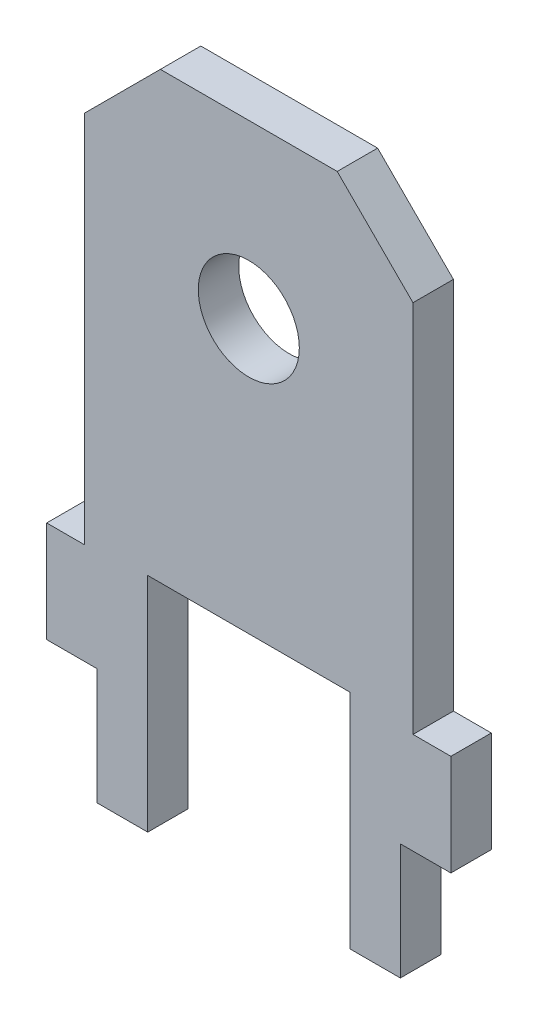
ISO-10303-21;
HEADER;
FILE_DESCRIPTION(('STEP AP214'),'2;1');
FILE_NAME('part.step','',(''),(''),'','','');
FILE_SCHEMA(('AUTOMOTIVE_DESIGN { 1 0 10303 214 1 1 1 1 }'));
ENDSEC;
DATA;
#1=APPLICATION_CONTEXT('core data for automotive mechanical design processes');
#2=APPLICATION_PROTOCOL_DEFINITION('international standard','automotive_design',2000,#1);
#3=PRODUCT_CONTEXT('',#1,'mechanical');
#4=PRODUCT('Part','Part','',(#3));
#5=PRODUCT_RELATED_PRODUCT_CATEGORY('part','',(#4));
#6=PRODUCT_DEFINITION_FORMATION('','',#4);
#7=PRODUCT_DEFINITION_CONTEXT('part definition',#1,'design');
#8=PRODUCT_DEFINITION('design','',#6,#7);
#9=PRODUCT_DEFINITION_SHAPE('','',#8);
#10=(LENGTH_UNIT() NAMED_UNIT(*) SI_UNIT(.MILLI.,.METRE.));
#11=(NAMED_UNIT(*) PLANE_ANGLE_UNIT() SI_UNIT($,.RADIAN.));
#12=(NAMED_UNIT(*) SI_UNIT($,.STERADIAN.) SOLID_ANGLE_UNIT());
#13=UNCERTAINTY_MEASURE_WITH_UNIT(LENGTH_MEASURE(1.E-05),#10,'distance_accuracy_value','');
#14=(GEOMETRIC_REPRESENTATION_CONTEXT(3) GLOBAL_UNCERTAINTY_ASSIGNED_CONTEXT((#13)) GLOBAL_UNIT_ASSIGNED_CONTEXT((#10,
#11,#12)) REPRESENTATION_CONTEXT('',''));
#15=CARTESIAN_POINT('',(0.,0.,0.));
#16=DIRECTION('',(0.,0.,1.));
#17=DIRECTION('',(1.,0.,0.));
#18=AXIS2_PLACEMENT_3D('',#15,#16,#17);
#19=CARTESIAN_POINT('',(-2.99999999999999,25.7495027624309,0.8));
#20=DIRECTION('',(0.,0.,-1.));
#21=DIRECTION('',(-1.,0.,0.));
#22=AXIS2_PLACEMENT_3D('',#19,#20,#21);
#23=PLANE('',#22);
#24=DIRECTION('',(0.,-1.,0.));
#25=VECTOR('',#24,1.);
#26=CARTESIAN_POINT('',(-3.,12.5495027624309,0.8));
#27=LINE('',#26,#25);
#28=CARTESIAN_POINT('',(-3.,14.8495027624309,0.8));
#29=VERTEX_POINT('',#28);
#30=CARTESIAN_POINT('',(-3.,12.5495027624309,0.8));
#31=VERTEX_POINT('',#30);
#32=EDGE_CURVE('E229',#29,#31,#27,.T.);
#33=ORIENTED_EDGE('',*,*,#32,.T.);
#34=DIRECTION('',(1.,0.,0.));
#35=VECTOR('',#34,1.);
#36=CARTESIAN_POINT('',(-3.,12.5495027624309,0.8));
#37=LINE('',#36,#35);
#38=CARTESIAN_POINT('',(-2.,12.5495027624309,0.8));
#39=VERTEX_POINT('',#38);
#40=EDGE_CURVE('E127',#31,#39,#37,.T.);
#41=ORIENTED_EDGE('',*,*,#40,.T.);
#42=DIRECTION('',(0.,1.,0.));
#43=VECTOR('',#42,1.);
#44=CARTESIAN_POINT('',(-2.,12.5495027624309,0.8));
#45=LINE('',#44,#43);
#46=CARTESIAN_POINT('',(-2.,16.9495027624309,0.8));
#47=VERTEX_POINT('',#46);
#48=EDGE_CURVE('E274',#39,#47,#45,.T.);
#49=ORIENTED_EDGE('',*,*,#48,.T.);
#50=DIRECTION('',(1.,0.,0.));
#51=VECTOR('',#50,1.);
#52=CARTESIAN_POINT('',(-2.,16.9495027624309,0.8));
#53=LINE('',#52,#51);
#54=CARTESIAN_POINT('',(2.,16.9495027624309,0.8));
#55=VERTEX_POINT('',#54);
#56=EDGE_CURVE('E293',#47,#55,#53,.T.);
#57=ORIENTED_EDGE('',*,*,#56,.T.);
#58=DIRECTION('',(0.,-1.,0.));
#59=VECTOR('',#58,1.);
#60=CARTESIAN_POINT('',(2.,12.5495027624309,0.8));
#61=LINE('',#60,#59);
#62=CARTESIAN_POINT('',(2.,12.5495027624309,0.8));
#63=VERTEX_POINT('',#62);
#64=EDGE_CURVE('E290',#55,#63,#61,.T.);
#65=ORIENTED_EDGE('',*,*,#64,.T.);
#66=DIRECTION('',(1.,0.,0.));
#67=VECTOR('',#66,1.);
#68=CARTESIAN_POINT('',(2.,12.5495027624309,0.8));
#69=LINE('',#68,#67);
#70=CARTESIAN_POINT('',(3.,12.5495027624309,0.8));
#71=VERTEX_POINT('',#70);
#72=EDGE_CURVE('E292',#63,#71,#69,.T.);
#73=ORIENTED_EDGE('',*,*,#72,.T.);
#74=DIRECTION('',(0.,1.,0.));
#75=VECTOR('',#74,1.);
#76=CARTESIAN_POINT('',(3.,12.5495027624309,0.8));
#77=LINE('',#76,#75);
#78=CARTESIAN_POINT('',(3.,14.8495027624309,0.8));
#79=VERTEX_POINT('',#78);
#80=EDGE_CURVE('E295',#71,#79,#77,.T.);
#81=ORIENTED_EDGE('',*,*,#80,.T.);
#82=DIRECTION('',(1.,0.,0.));
#83=VECTOR('',#82,1.);
#84=CARTESIAN_POINT('',(3.,14.8495027624309,0.8));
#85=LINE('',#84,#83);
#86=CARTESIAN_POINT('',(4.,14.8495027624309,0.8));
#87=VERTEX_POINT('',#86);
#88=EDGE_CURVE('E301',#79,#87,#85,.T.);
#89=ORIENTED_EDGE('',*,*,#88,.T.);
#90=DIRECTION('',(0.,1.,0.));
#91=VECTOR('',#90,1.);
#92=CARTESIAN_POINT('',(4.,14.8495027624309,0.8));
#93=LINE('',#92,#91);
#94=CARTESIAN_POINT('',(4.,16.8495027624309,0.8));
#95=VERTEX_POINT('',#94);
#96=EDGE_CURVE('E303',#87,#95,#93,.T.);
#97=ORIENTED_EDGE('',*,*,#96,.T.);
#98=DIRECTION('',(-1.,0.,0.));
#99=VECTOR('',#98,1.);
#100=CARTESIAN_POINT('',(3.25000000000001,16.8495027624309,0.8));
#101=LINE('',#100,#99);
#102=CARTESIAN_POINT('',(3.25000000000001,16.8495027624309,0.8));
#103=VERTEX_POINT('',#102);
#104=EDGE_CURVE('E305',#95,#103,#101,.T.);
#105=ORIENTED_EDGE('',*,*,#104,.T.);
#106=DIRECTION('',(0.,1.,0.));
#107=VECTOR('',#106,1.);
#108=CARTESIAN_POINT('',(3.25000000000001,16.8495027624309,0.8));
#109=LINE('',#108,#107);
#110=CARTESIAN_POINT('',(3.25,24.2495027624309,0.8));
#111=VERTEX_POINT('',#110);
#112=EDGE_CURVE('E307',#103,#111,#109,.T.);
#113=ORIENTED_EDGE('',*,*,#112,.T.);
#114=DIRECTION('',(-0.707106781186548,0.707106781186547,0.));
#115=VECTOR('',#114,1.);
#116=CARTESIAN_POINT('',(1.75,25.7495027624309,0.8));
#117=LINE('',#116,#115);
#118=CARTESIAN_POINT('',(1.75,25.7495027624309,0.8));
#119=VERTEX_POINT('',#118);
#120=EDGE_CURVE('E309',#111,#119,#117,.T.);
#121=ORIENTED_EDGE('',*,*,#120,.T.);
#122=DIRECTION('',(-1.,0.,0.));
#123=VECTOR('',#122,1.);
#124=CARTESIAN_POINT('',(-1.75,25.7495027624309,0.8));
#125=LINE('',#124,#123);
#126=CARTESIAN_POINT('',(-1.75,25.7495027624309,0.8));
#127=VERTEX_POINT('',#126);
#128=EDGE_CURVE('E311',#119,#127,#125,.T.);
#129=ORIENTED_EDGE('',*,*,#128,.T.);
#130=DIRECTION('',(-0.707106781186548,-0.707106781186547,0.));
#131=VECTOR('',#130,1.);
#132=CARTESIAN_POINT('',(-3.25,24.2495027624309,0.8));
#133=LINE('',#132,#131);
#134=CARTESIAN_POINT('',(-3.25,24.2495027624309,0.8));
#135=VERTEX_POINT('',#134);
#136=EDGE_CURVE('E313',#127,#135,#133,.T.);
#137=ORIENTED_EDGE('',*,*,#136,.T.);
#138=DIRECTION('',(0.,-1.,0.));
#139=VECTOR('',#138,1.);
#140=CARTESIAN_POINT('',(-3.25000000000001,16.8495027624309,0.8));
#141=LINE('',#140,#139);
#142=CARTESIAN_POINT('',(-3.25000000000001,16.8495027624309,0.8));
#143=VERTEX_POINT('',#142);
#144=EDGE_CURVE('E176',#135,#143,#141,.T.);
#145=ORIENTED_EDGE('',*,*,#144,.T.);
#146=DIRECTION('',(-1.,0.,0.));
#147=VECTOR('',#146,1.);
#148=CARTESIAN_POINT('',(-3.25000000000001,16.8495027624309,0.8));
#149=LINE('',#148,#147);
#150=CARTESIAN_POINT('',(-4.,16.8495027624309,0.8));
#151=VERTEX_POINT('',#150);
#152=EDGE_CURVE('E170',#143,#151,#149,.T.);
#153=ORIENTED_EDGE('',*,*,#152,.T.);
#154=DIRECTION('',(0.,-1.,0.));
#155=VECTOR('',#154,1.);
#156=CARTESIAN_POINT('',(-4.,14.8495027624309,0.8));
#157=LINE('',#156,#155);
#158=CARTESIAN_POINT('',(-4.,14.8495027624309,0.8));
#159=VERTEX_POINT('',#158);
#160=EDGE_CURVE('E174',#151,#159,#157,.T.);
#161=ORIENTED_EDGE('',*,*,#160,.T.);
#162=DIRECTION('',(1.,0.,0.));
#163=VECTOR('',#162,1.);
#164=CARTESIAN_POINT('',(-3.,14.8495027624309,0.8));
#165=LINE('',#164,#163);
#166=EDGE_CURVE('E54',#159,#29,#165,.T.);
#167=ORIENTED_EDGE('',*,*,#166,.T.);
#168=EDGE_LOOP('',(#33,#41,#49,#57,#65,#73,#81,#89,#97,#105,#113,#121,#129,#137,#145,#153,#161,#167));
#169=FACE_BOUND('',#168,.T.);
#170=CARTESIAN_POINT('',(0.,22.3495027624309,0.8));
#171=DIRECTION('',(0.,0.,1.));
#172=DIRECTION('',(1.,0.,0.));
#173=AXIS2_PLACEMENT_3D('',#170,#171,#172);
#174=CIRCLE('',#173,1.);
#175=CARTESIAN_POINT('',(1.,22.3495027624309,0.8));
#176=VERTEX_POINT('',#175);
#177=EDGE_CURVE('E198',#176,#176,#174,.T.);
#178=ORIENTED_EDGE('',*,*,#177,.F.);
#179=EDGE_LOOP('',(#178));
#180=FACE_BOUND('',#179,.T.);
#181=ADVANCED_FACE('F37',(#169,#180),#23,.F.);
#182=CARTESIAN_POINT('',(-2.99999999999999,25.7495027624309,0.));
#183=DIRECTION('',(0.,0.,-1.));
#184=DIRECTION('',(-1.,0.,0.));
#185=AXIS2_PLACEMENT_3D('',#182,#183,#184);
#186=PLANE('',#185);
#187=DIRECTION('',(0.,-1.,0.));
#188=VECTOR('',#187,1.);
#189=CARTESIAN_POINT('',(-3.,12.5495027624309,0.));
#190=LINE('',#189,#188);
#191=CARTESIAN_POINT('',(-3.,14.8495027624309,0.));
#192=VERTEX_POINT('',#191);
#193=CARTESIAN_POINT('',(-3.,12.5495027624309,0.));
#194=VERTEX_POINT('',#193);
#195=EDGE_CURVE('E194',#192,#194,#190,.T.);
#196=ORIENTED_EDGE('',*,*,#195,.F.);
#197=DIRECTION('',(1.,0.,0.));
#198=VECTOR('',#197,1.);
#199=CARTESIAN_POINT('',(-3.,14.8495027624309,0.));
#200=LINE('',#199,#198);
#201=CARTESIAN_POINT('',(-4.,14.8495027624309,0.));
#202=VERTEX_POINT('',#201);
#203=EDGE_CURVE('E119',#202,#192,#200,.T.);
#204=ORIENTED_EDGE('',*,*,#203,.F.);
#205=DIRECTION('',(0.,-1.,0.));
#206=VECTOR('',#205,1.);
#207=CARTESIAN_POINT('',(-4.,14.8495027624309,0.));
#208=LINE('',#207,#206);
#209=CARTESIAN_POINT('',(-4.,16.8495027624309,0.));
#210=VERTEX_POINT('',#209);
#211=EDGE_CURVE('E113',#210,#202,#208,.T.);
#212=ORIENTED_EDGE('',*,*,#211,.F.);
#213=DIRECTION('',(-1.,0.,0.));
#214=VECTOR('',#213,1.);
#215=CARTESIAN_POINT('',(-3.25000000000001,16.8495027624309,0.));
#216=LINE('',#215,#214);
#217=CARTESIAN_POINT('',(-3.25000000000001,16.8495027624309,0.));
#218=VERTEX_POINT('',#217);
#219=EDGE_CURVE('E184',#218,#210,#216,.T.);
#220=ORIENTED_EDGE('',*,*,#219,.F.);
#221=DIRECTION('',(0.,-1.,0.));
#222=VECTOR('',#221,1.);
#223=CARTESIAN_POINT('',(-3.25000000000001,16.8495027624309,0.));
#224=LINE('',#223,#222);
#225=CARTESIAN_POINT('',(-3.25,24.2495027624309,0.));
#226=VERTEX_POINT('',#225);
#227=EDGE_CURVE('E224',#226,#218,#224,.T.);
#228=ORIENTED_EDGE('',*,*,#227,.F.);
#229=DIRECTION('',(-0.707106781186548,-0.707106781186547,0.));
#230=VECTOR('',#229,1.);
#231=CARTESIAN_POINT('',(-3.25,24.2495027624309,0.));
#232=LINE('',#231,#230);
#233=CARTESIAN_POINT('',(-1.75,25.7495027624309,0.));
#234=VERTEX_POINT('',#233);
#235=EDGE_CURVE('E222',#234,#226,#232,.T.);
#236=ORIENTED_EDGE('',*,*,#235,.F.);
#237=DIRECTION('',(-1.,0.,0.));
#238=VECTOR('',#237,1.);
#239=CARTESIAN_POINT('',(-1.75,25.7495027624309,0.));
#240=LINE('',#239,#238);
#241=CARTESIAN_POINT('',(1.75,25.7495027624309,0.));
#242=VERTEX_POINT('',#241);
#243=EDGE_CURVE('E220',#242,#234,#240,.T.);
#244=ORIENTED_EDGE('',*,*,#243,.F.);
#245=DIRECTION('',(-0.707106781186548,0.707106781186547,0.));
#246=VECTOR('',#245,1.);
#247=CARTESIAN_POINT('',(1.75,25.7495027624309,0.));
#248=LINE('',#247,#246);
#249=CARTESIAN_POINT('',(3.25,24.2495027624309,0.));
#250=VERTEX_POINT('',#249);
#251=EDGE_CURVE('E218',#250,#242,#248,.T.);
#252=ORIENTED_EDGE('',*,*,#251,.F.);
#253=DIRECTION('',(0.,1.,0.));
#254=VECTOR('',#253,1.);
#255=CARTESIAN_POINT('',(3.25000000000001,16.8495027624309,0.));
#256=LINE('',#255,#254);
#257=CARTESIAN_POINT('',(3.25000000000001,16.8495027624309,0.));
#258=VERTEX_POINT('',#257);
#259=EDGE_CURVE('E216',#258,#250,#256,.T.);
#260=ORIENTED_EDGE('',*,*,#259,.F.);
#261=DIRECTION('',(-1.,0.,0.));
#262=VECTOR('',#261,1.);
#263=CARTESIAN_POINT('',(3.25000000000001,16.8495027624309,0.));
#264=LINE('',#263,#262);
#265=CARTESIAN_POINT('',(4.,16.8495027624309,0.));
#266=VERTEX_POINT('',#265);
#267=EDGE_CURVE('E214',#266,#258,#264,.T.);
#268=ORIENTED_EDGE('',*,*,#267,.F.);
#269=DIRECTION('',(0.,1.,0.));
#270=VECTOR('',#269,1.);
#271=CARTESIAN_POINT('',(4.,14.8495027624309,0.));
#272=LINE('',#271,#270);
#273=CARTESIAN_POINT('',(4.,14.8495027624309,0.));
#274=VERTEX_POINT('',#273);
#275=EDGE_CURVE('E212',#274,#266,#272,.T.);
#276=ORIENTED_EDGE('',*,*,#275,.F.);
#277=DIRECTION('',(1.,0.,0.));
#278=VECTOR('',#277,1.);
#279=CARTESIAN_POINT('',(3.,14.8495027624309,0.));
#280=LINE('',#279,#278);
#281=CARTESIAN_POINT('',(3.,14.8495027624309,0.));
#282=VERTEX_POINT('',#281);
#283=EDGE_CURVE('E210',#282,#274,#280,.T.);
#284=ORIENTED_EDGE('',*,*,#283,.F.);
#285=DIRECTION('',(0.,1.,0.));
#286=VECTOR('',#285,1.);
#287=CARTESIAN_POINT('',(3.,12.5495027624309,0.));
#288=LINE('',#287,#286);
#289=CARTESIAN_POINT('',(3.,12.5495027624309,0.));
#290=VERTEX_POINT('',#289);
#291=EDGE_CURVE('E208',#290,#282,#288,.T.);
#292=ORIENTED_EDGE('',*,*,#291,.F.);
#293=DIRECTION('',(1.,0.,0.));
#294=VECTOR('',#293,1.);
#295=CARTESIAN_POINT('',(2.,12.5495027624309,0.));
#296=LINE('',#295,#294);
#297=CARTESIAN_POINT('',(2.,12.5495027624309,0.));
#298=VERTEX_POINT('',#297);
#299=EDGE_CURVE('E206',#298,#290,#296,.T.);
#300=ORIENTED_EDGE('',*,*,#299,.F.);
#301=DIRECTION('',(0.,-1.,0.));
#302=VECTOR('',#301,1.);
#303=CARTESIAN_POINT('',(2.,12.5495027624309,0.));
#304=LINE('',#303,#302);
#305=CARTESIAN_POINT('',(2.,16.9495027624309,0.));
#306=VERTEX_POINT('',#305);
#307=EDGE_CURVE('E204',#306,#298,#304,.T.);
#308=ORIENTED_EDGE('',*,*,#307,.F.);
#309=DIRECTION('',(1.,0.,0.));
#310=VECTOR('',#309,1.);
#311=CARTESIAN_POINT('',(-2.,16.9495027624309,0.));
#312=LINE('',#311,#310);
#313=CARTESIAN_POINT('',(-2.,16.9495027624309,0.));
#314=VERTEX_POINT('',#313);
#315=EDGE_CURVE('E202',#314,#306,#312,.T.);
#316=ORIENTED_EDGE('',*,*,#315,.F.);
#317=DIRECTION('',(0.,1.,0.));
#318=VECTOR('',#317,1.);
#319=CARTESIAN_POINT('',(-2.,12.5495027624309,0.));
#320=LINE('',#319,#318);
#321=CARTESIAN_POINT('',(-2.,12.5495027624309,0.));
#322=VERTEX_POINT('',#321);
#323=EDGE_CURVE('E200',#322,#314,#320,.T.);
#324=ORIENTED_EDGE('',*,*,#323,.F.);
#325=DIRECTION('',(1.,0.,0.));
#326=VECTOR('',#325,1.);
#327=CARTESIAN_POINT('',(-3.,12.5495027624309,0.));
#328=LINE('',#327,#326);
#329=EDGE_CURVE('E197',#194,#322,#328,.T.);
#330=ORIENTED_EDGE('',*,*,#329,.F.);
#331=EDGE_LOOP('',(#196,#204,#212,#220,#228,#236,#244,#252,#260,#268,#276,#284,#292,#300,#308,
#316,#324,#330));
#332=FACE_BOUND('',#331,.T.);
#333=CARTESIAN_POINT('',(0.,22.3495027624309,0.));
#334=DIRECTION('',(0.,0.,1.));
#335=DIRECTION('',(1.,0.,0.));
#336=AXIS2_PLACEMENT_3D('',#333,#334,#335);
#337=CIRCLE('',#336,1.);
#338=CARTESIAN_POINT('',(1.,22.3495027624309,0.));
#339=VERTEX_POINT('',#338);
#340=EDGE_CURVE('E375',#339,#339,#337,.T.);
#341=ORIENTED_EDGE('',*,*,#340,.T.);
#342=EDGE_LOOP('',(#341));
#343=FACE_BOUND('',#342,.T.);
#344=ADVANCED_FACE('F278',(#332,#343),#186,.T.);
#345=CARTESIAN_POINT('',(-3.,12.5495027624309,0.8));
#346=DIRECTION('',(1.,0.,0.));
#347=DIRECTION('',(0.,1.,0.));
#348=AXIS2_PLACEMENT_3D('',#345,#346,#347);
#349=PLANE('',#348);
#350=ORIENTED_EDGE('',*,*,#195,.T.);
#351=DIRECTION('',(0.,0.,-1.));
#352=VECTOR('',#351,1.);
#353=CARTESIAN_POINT('',(-3.,12.5495027624309,0.8));
#354=LINE('',#353,#352);
#355=EDGE_CURVE('E11',#31,#194,#354,.T.);
#356=ORIENTED_EDGE('',*,*,#355,.F.);
#357=ORIENTED_EDGE('',*,*,#32,.F.);
#358=DIRECTION('',(0.,0.,-1.));
#359=VECTOR('',#358,1.);
#360=CARTESIAN_POINT('',(-3.,14.8495027624309,0.8));
#361=LINE('',#360,#359);
#362=EDGE_CURVE('E190',#29,#192,#361,.T.);
#363=ORIENTED_EDGE('',*,*,#362,.T.);
#364=EDGE_LOOP('',(#350,#356,#357,#363));
#365=FACE_BOUND('',#364,.T.);
#366=ADVANCED_FACE('F39',(#365),#349,.F.);
#367=CARTESIAN_POINT('',(-3.,12.5495027624309,0.8));
#368=DIRECTION('',(0.,1.,0.));
#369=DIRECTION('',(0.,0.,1.));
#370=AXIS2_PLACEMENT_3D('',#367,#368,#369);
#371=PLANE('',#370);
#372=CARTESIAN_POINT('',(-2.5,12.5495027624309,0.4));
#373=DIRECTION('',(0.,-1.,0.));
#374=DIRECTION('',(0.,0.,1.));
#375=AXIS2_PLACEMENT_3D('',#372,#373,#374);
#376=CIRCLE('',#375,0.25);
#377=CARTESIAN_POINT('',(-2.5,12.5495027624309,0.65));
#378=VERTEX_POINT('',#377);
#379=EDGE_CURVE('E366',#378,#378,#376,.T.);
#380=ORIENTED_EDGE('',*,*,#379,.F.);
#381=EDGE_LOOP('',(#380));
#382=FACE_BOUND('',#381,.T.);
#383=ORIENTED_EDGE('',*,*,#329,.T.);
#384=DIRECTION('',(0.,0.,-1.));
#385=VECTOR('',#384,1.);
#386=CARTESIAN_POINT('',(-2.,12.5495027624309,0.8));
#387=LINE('',#386,#385);
#388=EDGE_CURVE('E46',#39,#322,#387,.T.);
#389=ORIENTED_EDGE('',*,*,#388,.F.);
#390=ORIENTED_EDGE('',*,*,#40,.F.);
#391=ORIENTED_EDGE('',*,*,#355,.T.);
#392=EDGE_LOOP('',(#383,#389,#390,#391));
#393=FACE_BOUND('',#392,.T.);
#394=ADVANCED_FACE('F452',(#382,#393),#371,.F.);
#395=CARTESIAN_POINT('',(-2.,12.5495027624309,0.8));
#396=DIRECTION('',(-1.,0.,0.));
#397=DIRECTION('',(0.,-1.,0.));
#398=AXIS2_PLACEMENT_3D('',#395,#396,#397);
#399=PLANE('',#398);
#400=ORIENTED_EDGE('',*,*,#323,.T.);
#401=DIRECTION('',(0.,0.,-1.));
#402=VECTOR('',#401,1.);
#403=CARTESIAN_POINT('',(-2.,16.9495027624309,0.8));
#404=LINE('',#403,#402);
#405=EDGE_CURVE('E266',#47,#314,#404,.T.);
#406=ORIENTED_EDGE('',*,*,#405,.F.);
#407=ORIENTED_EDGE('',*,*,#48,.F.);
#408=ORIENTED_EDGE('',*,*,#388,.T.);
#409=EDGE_LOOP('',(#400,#406,#407,#408));
#410=FACE_BOUND('',#409,.T.);
#411=ADVANCED_FACE('F272',(#410),#399,.F.);
#412=CARTESIAN_POINT('',(-2.,16.9495027624309,0.8));
#413=DIRECTION('',(0.,1.,0.));
#414=DIRECTION('',(0.,0.,1.));
#415=AXIS2_PLACEMENT_3D('',#412,#413,#414);
#416=PLANE('',#415);
#417=ORIENTED_EDGE('',*,*,#315,.T.);
#418=DIRECTION('',(0.,0.,-1.));
#419=VECTOR('',#418,1.);
#420=CARTESIAN_POINT('',(2.,16.9495027624309,0.8));
#421=LINE('',#420,#419);
#422=EDGE_CURVE('E263',#55,#306,#421,.T.);
#423=ORIENTED_EDGE('',*,*,#422,.F.);
#424=ORIENTED_EDGE('',*,*,#56,.F.);
#425=ORIENTED_EDGE('',*,*,#405,.T.);
#426=EDGE_LOOP('',(#417,#423,#424,#425));
#427=FACE_BOUND('',#426,.T.);
#428=ADVANCED_FACE('F284',(#427),#416,.F.);
#429=CARTESIAN_POINT('',(2.,12.5495027624309,0.8));
#430=DIRECTION('',(1.,0.,0.));
#431=DIRECTION('',(0.,0.,-1.));
#432=AXIS2_PLACEMENT_3D('',#429,#430,#431);
#433=PLANE('',#432);
#434=ORIENTED_EDGE('',*,*,#307,.T.);
#435=DIRECTION('',(0.,0.,-1.));
#436=VECTOR('',#435,1.);
#437=CARTESIAN_POINT('',(2.,12.5495027624309,0.8));
#438=LINE('',#437,#436);
#439=EDGE_CURVE('E260',#63,#298,#438,.T.);
#440=ORIENTED_EDGE('',*,*,#439,.F.);
#441=ORIENTED_EDGE('',*,*,#64,.F.);
#442=ORIENTED_EDGE('',*,*,#422,.T.);
#443=EDGE_LOOP('',(#434,#440,#441,#442));
#444=FACE_BOUND('',#443,.T.);
#445=ADVANCED_FACE('F288',(#444),#433,.F.);
#446=CARTESIAN_POINT('',(2.,12.5495027624309,0.8));
#447=DIRECTION('',(0.,1.,0.));
#448=DIRECTION('',(0.,0.,1.));
#449=AXIS2_PLACEMENT_3D('',#446,#447,#448);
#450=PLANE('',#449);
#451=CARTESIAN_POINT('',(2.5,12.5495027624309,0.4));
#452=DIRECTION('',(0.,-1.,0.));
#453=DIRECTION('',(0.,0.,-1.));
#454=AXIS2_PLACEMENT_3D('',#451,#452,#453);
#455=CIRCLE('',#454,0.25);
#456=CARTESIAN_POINT('',(2.5,12.5495027624309,0.15));
#457=VERTEX_POINT('',#456);
#458=EDGE_CURVE('E365',#457,#457,#455,.T.);
#459=ORIENTED_EDGE('',*,*,#458,.F.);
#460=EDGE_LOOP('',(#459));
#461=FACE_BOUND('',#460,.T.);
#462=ORIENTED_EDGE('',*,*,#299,.T.);
#463=DIRECTION('',(0.,0.,-1.));
#464=VECTOR('',#463,1.);
#465=CARTESIAN_POINT('',(3.,12.5495027624309,0.8));
#466=LINE('',#465,#464);
#467=EDGE_CURVE('E257',#71,#290,#466,.T.);
#468=ORIENTED_EDGE('',*,*,#467,.F.);
#469=ORIENTED_EDGE('',*,*,#72,.F.);
#470=ORIENTED_EDGE('',*,*,#439,.T.);
#471=EDGE_LOOP('',(#462,#468,#469,#470));
#472=FACE_BOUND('',#471,.T.);
#473=ADVANCED_FACE('F389',(#461,#472),#450,.F.);
#474=CARTESIAN_POINT('',(3.,12.5495027624309,0.8));
#475=DIRECTION('',(-1.,0.,0.));
#476=DIRECTION('',(0.,-1.,0.));
#477=AXIS2_PLACEMENT_3D('',#474,#475,#476);
#478=PLANE('',#477);
#479=ORIENTED_EDGE('',*,*,#291,.T.);
#480=DIRECTION('',(0.,0.,-1.));
#481=VECTOR('',#480,1.);
#482=CARTESIAN_POINT('',(3.,14.8495027624309,0.8));
#483=LINE('',#482,#481);
#484=EDGE_CURVE('E254',#79,#282,#483,.T.);
#485=ORIENTED_EDGE('',*,*,#484,.F.);
#486=ORIENTED_EDGE('',*,*,#80,.F.);
#487=ORIENTED_EDGE('',*,*,#467,.T.);
#488=EDGE_LOOP('',(#479,#485,#486,#487));
#489=FACE_BOUND('',#488,.T.);
#490=ADVANCED_FACE('F392',(#489),#478,.F.);
#491=CARTESIAN_POINT('',(3.,14.8495027624309,0.8));
#492=DIRECTION('',(0.,1.,0.));
#493=DIRECTION('',(0.,0.,1.));
#494=AXIS2_PLACEMENT_3D('',#491,#492,#493);
#495=PLANE('',#494);
#496=ORIENTED_EDGE('',*,*,#283,.T.);
#497=DIRECTION('',(0.,0.,-1.));
#498=VECTOR('',#497,1.);
#499=CARTESIAN_POINT('',(4.,14.8495027624309,0.8));
#500=LINE('',#499,#498);
#501=EDGE_CURVE('E251',#87,#274,#500,.T.);
#502=ORIENTED_EDGE('',*,*,#501,.F.);
#503=ORIENTED_EDGE('',*,*,#88,.F.);
#504=ORIENTED_EDGE('',*,*,#484,.T.);
#505=EDGE_LOOP('',(#496,#502,#503,#504));
#506=FACE_BOUND('',#505,.T.);
#507=ADVANCED_FACE('F404',(#506),#495,.F.);
#508=CARTESIAN_POINT('',(4.,14.8495027624309,0.8));
#509=DIRECTION('',(-1.,0.,0.));
#510=DIRECTION('',(0.,0.,1.));
#511=AXIS2_PLACEMENT_3D('',#508,#509,#510);
#512=PLANE('',#511);
#513=ORIENTED_EDGE('',*,*,#275,.T.);
#514=DIRECTION('',(0.,0.,-1.));
#515=VECTOR('',#514,1.);
#516=CARTESIAN_POINT('',(4.,16.8495027624309,0.8));
#517=LINE('',#516,#515);
#518=EDGE_CURVE('E248',#95,#266,#517,.T.);
#519=ORIENTED_EDGE('',*,*,#518,.F.);
#520=ORIENTED_EDGE('',*,*,#96,.F.);
#521=ORIENTED_EDGE('',*,*,#501,.T.);
#522=EDGE_LOOP('',(#513,#519,#520,#521));
#523=FACE_BOUND('',#522,.T.);
#524=ADVANCED_FACE('F408',(#523),#512,.F.);
#525=CARTESIAN_POINT('',(3.25000000000001,16.8495027624309,0.8));
#526=DIRECTION('',(0.,-1.,0.));
#527=DIRECTION('',(0.,0.,-1.));
#528=AXIS2_PLACEMENT_3D('',#525,#526,#527);
#529=PLANE('',#528);
#530=ORIENTED_EDGE('',*,*,#267,.T.);
#531=DIRECTION('',(0.,0.,-1.));
#532=VECTOR('',#531,1.);
#533=CARTESIAN_POINT('',(3.25000000000001,16.8495027624309,0.8));
#534=LINE('',#533,#532);
#535=EDGE_CURVE('E245',#103,#258,#534,.T.);
#536=ORIENTED_EDGE('',*,*,#535,.F.);
#537=ORIENTED_EDGE('',*,*,#104,.F.);
#538=ORIENTED_EDGE('',*,*,#518,.T.);
#539=EDGE_LOOP('',(#530,#536,#537,#538));
#540=FACE_BOUND('',#539,.T.);
#541=ADVANCED_FACE('F415',(#540),#529,.F.);
#542=CARTESIAN_POINT('',(3.25000000000001,16.8495027624309,0.8));
#543=DIRECTION('',(-1.,0.,0.));
#544=DIRECTION('',(0.,-1.,0.));
#545=AXIS2_PLACEMENT_3D('',#542,#543,#544);
#546=PLANE('',#545);
#547=ORIENTED_EDGE('',*,*,#259,.T.);
#548=DIRECTION('',(0.,0.,-1.));
#549=VECTOR('',#548,1.);
#550=CARTESIAN_POINT('',(3.25,24.2495027624309,0.8));
#551=LINE('',#550,#549);
#552=EDGE_CURVE('E242',#111,#250,#551,.T.);
#553=ORIENTED_EDGE('',*,*,#552,.F.);
#554=ORIENTED_EDGE('',*,*,#112,.F.);
#555=ORIENTED_EDGE('',*,*,#535,.T.);
#556=EDGE_LOOP('',(#547,#553,#554,#555));
#557=FACE_BOUND('',#556,.T.);
#558=ADVANCED_FACE('F418',(#557),#546,.F.);
#559=CARTESIAN_POINT('',(1.75,25.7495027624309,0.8));
#560=DIRECTION('',(-0.707106781186547,-0.707106781186548,0.));
#561=DIRECTION('',(0.707106781186548,-0.707106781186547,0.));
#562=AXIS2_PLACEMENT_3D('',#559,#560,#561);
#563=PLANE('',#562);
#564=ORIENTED_EDGE('',*,*,#251,.T.);
#565=DIRECTION('',(0.,0.,-1.));
#566=VECTOR('',#565,1.);
#567=CARTESIAN_POINT('',(1.75,25.7495027624309,0.8));
#568=LINE('',#567,#566);
#569=EDGE_CURVE('E239',#119,#242,#568,.T.);
#570=ORIENTED_EDGE('',*,*,#569,.F.);
#571=ORIENTED_EDGE('',*,*,#120,.F.);
#572=ORIENTED_EDGE('',*,*,#552,.T.);
#573=EDGE_LOOP('',(#564,#570,#571,#572));
#574=FACE_BOUND('',#573,.T.);
#575=ADVANCED_FACE('F423',(#574),#563,.F.);
#576=CARTESIAN_POINT('',(-1.75,25.7495027624309,0.8));
#577=DIRECTION('',(0.,-1.,0.));
#578=DIRECTION('',(0.,0.,-1.));
#579=AXIS2_PLACEMENT_3D('',#576,#577,#578);
#580=PLANE('',#579);
#581=ORIENTED_EDGE('',*,*,#243,.T.);
#582=DIRECTION('',(0.,0.,-1.));
#583=VECTOR('',#582,1.);
#584=CARTESIAN_POINT('',(-1.75,25.7495027624309,0.8));
#585=LINE('',#584,#583);
#586=EDGE_CURVE('E236',#127,#234,#585,.T.);
#587=ORIENTED_EDGE('',*,*,#586,.F.);
#588=ORIENTED_EDGE('',*,*,#128,.F.);
#589=ORIENTED_EDGE('',*,*,#569,.T.);
#590=EDGE_LOOP('',(#581,#587,#588,#589));
#591=FACE_BOUND('',#590,.T.);
#592=ADVANCED_FACE('F426',(#591),#580,.F.);
#593=CARTESIAN_POINT('',(-3.25,24.2495027624309,0.8));
#594=DIRECTION('',(0.707106781186547,-0.707106781186548,0.));
#595=DIRECTION('',(0.707106781186548,0.707106781186547,0.));
#596=AXIS2_PLACEMENT_3D('',#593,#594,#595);
#597=PLANE('',#596);
#598=ORIENTED_EDGE('',*,*,#235,.T.);
#599=DIRECTION('',(0.,0.,-1.));
#600=VECTOR('',#599,1.);
#601=CARTESIAN_POINT('',(-3.25,24.2495027624309,0.8));
#602=LINE('',#601,#600);
#603=EDGE_CURVE('E233',#135,#226,#602,.T.);
#604=ORIENTED_EDGE('',*,*,#603,.F.);
#605=ORIENTED_EDGE('',*,*,#136,.F.);
#606=ORIENTED_EDGE('',*,*,#586,.T.);
#607=EDGE_LOOP('',(#598,#604,#605,#606));
#608=FACE_BOUND('',#607,.T.);
#609=ADVANCED_FACE('F319',(#608),#597,.F.);
#610=CARTESIAN_POINT('',(-3.25000000000001,16.8495027624309,0.8));
#611=DIRECTION('',(1.,0.,0.));
#612=DIRECTION('',(0.,1.,0.));
#613=AXIS2_PLACEMENT_3D('',#610,#611,#612);
#614=PLANE('',#613);
#615=ORIENTED_EDGE('',*,*,#227,.T.);
#616=DIRECTION('',(0.,0.,-1.));
#617=VECTOR('',#616,1.);
#618=CARTESIAN_POINT('',(-3.25000000000001,16.8495027624309,0.8));
#619=LINE('',#618,#617);
#620=EDGE_CURVE('E185',#143,#218,#619,.T.);
#621=ORIENTED_EDGE('',*,*,#620,.F.);
#622=ORIENTED_EDGE('',*,*,#144,.F.);
#623=ORIENTED_EDGE('',*,*,#603,.T.);
#624=EDGE_LOOP('',(#615,#621,#622,#623));
#625=FACE_BOUND('',#624,.T.);
#626=ADVANCED_FACE('F323',(#625),#614,.F.);
#627=CARTESIAN_POINT('',(-3.25000000000001,16.8495027624309,0.8));
#628=DIRECTION('',(0.,-1.,0.));
#629=DIRECTION('',(0.,0.,-1.));
#630=AXIS2_PLACEMENT_3D('',#627,#628,#629);
#631=PLANE('',#630);
#632=ORIENTED_EDGE('',*,*,#219,.T.);
#633=DIRECTION('',(0.,0.,-1.));
#634=VECTOR('',#633,1.);
#635=CARTESIAN_POINT('',(-4.,16.8495027624309,0.8));
#636=LINE('',#635,#634);
#637=EDGE_CURVE('E181',#151,#210,#636,.T.);
#638=ORIENTED_EDGE('',*,*,#637,.F.);
#639=ORIENTED_EDGE('',*,*,#152,.F.);
#640=ORIENTED_EDGE('',*,*,#620,.T.);
#641=EDGE_LOOP('',(#632,#638,#639,#640));
#642=FACE_BOUND('',#641,.T.);
#643=ADVANCED_FACE('F182',(#642),#631,.F.);
#644=CARTESIAN_POINT('',(-4.,14.8495027624309,0.8));
#645=DIRECTION('',(1.,0.,0.));
#646=DIRECTION('',(0.,0.,-1.));
#647=AXIS2_PLACEMENT_3D('',#644,#645,#646);
#648=PLANE('',#647);
#649=ORIENTED_EDGE('',*,*,#211,.T.);
#650=DIRECTION('',(0.,0.,-1.));
#651=VECTOR('',#650,1.);
#652=CARTESIAN_POINT('',(-4.,14.8495027624309,0.8));
#653=LINE('',#652,#651);
#654=EDGE_CURVE('E186',#159,#202,#653,.T.);
#655=ORIENTED_EDGE('',*,*,#654,.F.);
#656=ORIENTED_EDGE('',*,*,#160,.F.);
#657=ORIENTED_EDGE('',*,*,#637,.T.);
#658=EDGE_LOOP('',(#649,#655,#656,#657));
#659=FACE_BOUND('',#658,.T.);
#660=ADVANCED_FACE('F188',(#659),#648,.F.);
#661=CARTESIAN_POINT('',(-3.,14.8495027624309,0.8));
#662=DIRECTION('',(0.,1.,0.));
#663=DIRECTION('',(0.,0.,1.));
#664=AXIS2_PLACEMENT_3D('',#661,#662,#663);
#665=PLANE('',#664);
#666=ORIENTED_EDGE('',*,*,#203,.T.);
#667=ORIENTED_EDGE('',*,*,#362,.F.);
#668=ORIENTED_EDGE('',*,*,#166,.F.);
#669=ORIENTED_EDGE('',*,*,#654,.T.);
#670=EDGE_LOOP('',(#666,#667,#668,#669));
#671=FACE_BOUND('',#670,.T.);
#672=ADVANCED_FACE('F327',(#671),#665,.F.);
#673=CARTESIAN_POINT('',(0.,22.3495027624309,0.8));
#674=DIRECTION('',(0.,0.,-1.));
#675=DIRECTION('',(-1.,0.,0.));
#676=AXIS2_PLACEMENT_3D('',#673,#674,#675);
#677=CYLINDRICAL_SURFACE('',#676,1.);
#678=ORIENTED_EDGE('',*,*,#177,.T.);
#679=EDGE_LOOP('',(#678));
#680=FACE_BOUND('',#679,.T.);
#681=ORIENTED_EDGE('',*,*,#340,.F.);
#682=EDGE_LOOP('',(#681));
#683=FACE_BOUND('',#682,.T.);
#684=ADVANCED_FACE('F329',(#680,#683),#677,.F.);
#685=CARTESIAN_POINT('',(2.5,15.5495027624309,0.4));
#686=DIRECTION('',(0.,-1.,0.));
#687=DIRECTION('',(0.,0.,-1.));
#688=AXIS2_PLACEMENT_3D('',#685,#686,#687);
#689=CYLINDRICAL_SURFACE('',#688,0.25);
#690=CARTESIAN_POINT('',(2.5,15.5495027624309,0.4));
#691=DIRECTION('',(0.,-1.,0.));
#692=DIRECTION('',(0.,0.,-1.));
#693=AXIS2_PLACEMENT_3D('',#690,#691,#692);
#694=CIRCLE('',#693,0.25);
#695=CARTESIAN_POINT('',(2.5,15.5495027624309,0.15));
#696=VERTEX_POINT('',#695);
#697=EDGE_CURVE('E369',#696,#696,#694,.T.);
#698=ORIENTED_EDGE('',*,*,#697,.F.);
#699=EDGE_LOOP('',(#698));
#700=FACE_BOUND('',#699,.T.);
#701=ORIENTED_EDGE('',*,*,#458,.T.);
#702=EDGE_LOOP('',(#701));
#703=FACE_BOUND('',#702,.T.);
#704=ADVANCED_FACE('F335',(#700,#703),#689,.F.);
#705=CARTESIAN_POINT('',(2.5,15.5495027624309,0.4));
#706=DIRECTION('',(0.,-1.,0.));
#707=DIRECTION('',(0.,0.,-1.));
#708=AXIS2_PLACEMENT_3D('',#705,#706,#707);
#709=PLANE('',#708);
#710=ORIENTED_EDGE('',*,*,#697,.T.);
#711=EDGE_LOOP('',(#710));
#712=FACE_BOUND('',#711,.T.);
#713=ADVANCED_FACE('F348',(#712),#709,.T.);
#714=CARTESIAN_POINT('',(-2.5,15.5495027624309,0.4));
#715=DIRECTION('',(0.,-1.,0.));
#716=DIRECTION('',(0.,0.,-1.));
#717=AXIS2_PLACEMENT_3D('',#714,#715,#716);
#718=CYLINDRICAL_SURFACE('',#717,0.25);
#719=CARTESIAN_POINT('',(-2.5,15.5495027624309,0.4));
#720=DIRECTION('',(0.,-1.,0.));
#721=DIRECTION('',(0.,0.,1.));
#722=AXIS2_PLACEMENT_3D('',#719,#720,#721);
#723=CIRCLE('',#722,0.25);
#724=CARTESIAN_POINT('',(-2.5,15.5495027624309,0.65));
#725=VERTEX_POINT('',#724);
#726=EDGE_CURVE('E364',#725,#725,#723,.T.);
#727=ORIENTED_EDGE('',*,*,#726,.F.);
#728=EDGE_LOOP('',(#727));
#729=FACE_BOUND('',#728,.T.);
#730=ORIENTED_EDGE('',*,*,#379,.T.);
#731=EDGE_LOOP('',(#730));
#732=FACE_BOUND('',#731,.T.);
#733=ADVANCED_FACE('F352',(#729,#732),#718,.F.);
#734=CARTESIAN_POINT('',(-2.5,15.5495027624309,0.4));
#735=DIRECTION('',(0.,1.,0.));
#736=DIRECTION('',(0.,0.,1.));
#737=AXIS2_PLACEMENT_3D('',#734,#735,#736);
#738=PLANE('',#737);
#739=ORIENTED_EDGE('',*,*,#726,.T.);
#740=EDGE_LOOP('',(#739));
#741=FACE_BOUND('',#740,.T.);
#742=ADVANCED_FACE('F356',(#741),#738,.F.);
#743=CLOSED_SHELL('',(#181,#344,#366,#394,#411,#428,#445,#473,#490,#507,#524,#541,#558,#575,
#592,#609,#626,#643,#660,#672,#684,#704,#713,#733,#742));
#744=MANIFOLD_SOLID_BREP('B2',#743);
#745=ADVANCED_BREP_SHAPE_REPRESENTATION('',(#18,#744),#14);
#746=SHAPE_DEFINITION_REPRESENTATION(#9,#745);
ENDSEC;
END-ISO-10303-21;
